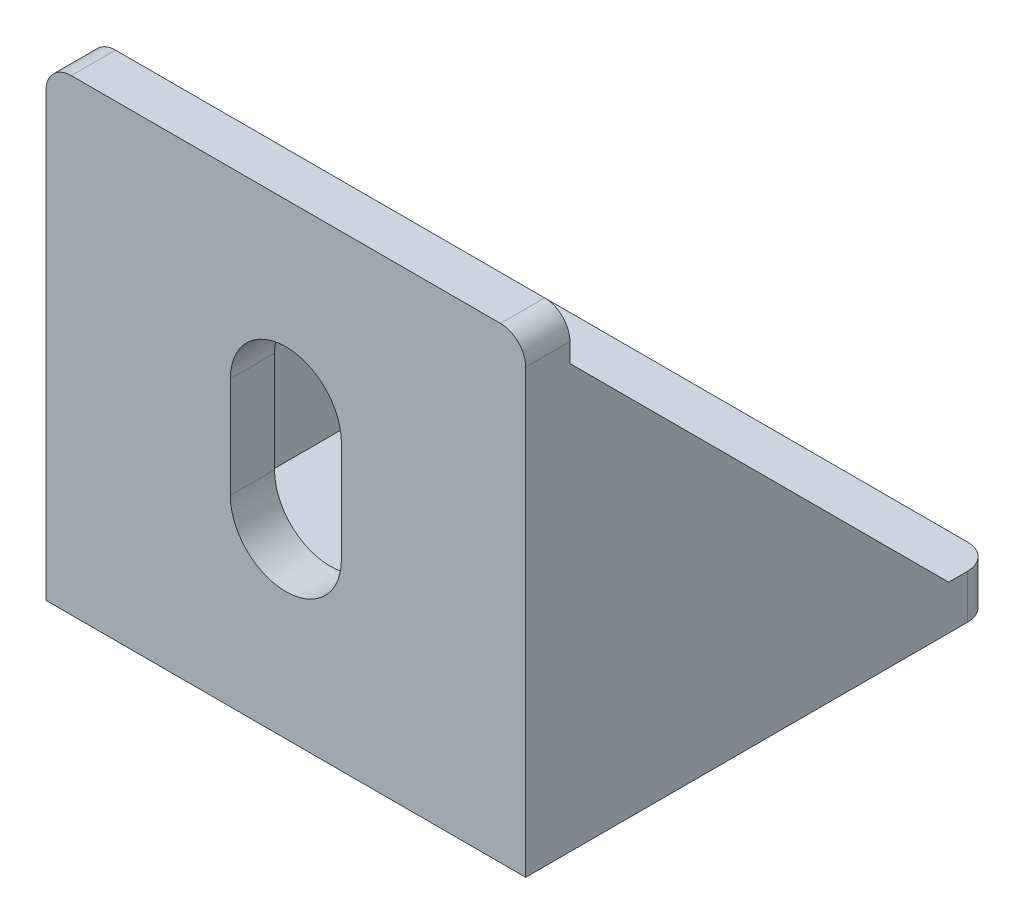
ISO-10303-21;
HEADER;
FILE_DESCRIPTION(('STEP AP214'),'2;1');
FILE_NAME('part.step','',(''),(''),'','','');
FILE_SCHEMA(('AUTOMOTIVE_DESIGN { 1 0 10303 214 1 1 1 1 }'));
ENDSEC;
DATA;
#1=APPLICATION_CONTEXT('core data for automotive mechanical design processes');
#2=APPLICATION_PROTOCOL_DEFINITION('international standard','automotive_design',2000,#1);
#3=PRODUCT_CONTEXT('',#1,'mechanical');
#4=PRODUCT('Part','Part','',(#3));
#5=PRODUCT_RELATED_PRODUCT_CATEGORY('part','',(#4));
#6=PRODUCT_DEFINITION_FORMATION('','',#4);
#7=PRODUCT_DEFINITION_CONTEXT('part definition',#1,'design');
#8=PRODUCT_DEFINITION('design','',#6,#7);
#9=PRODUCT_DEFINITION_SHAPE('','',#8);
#10=(LENGTH_UNIT() NAMED_UNIT(*) SI_UNIT(.MILLI.,.METRE.));
#11=(NAMED_UNIT(*) PLANE_ANGLE_UNIT() SI_UNIT($,.RADIAN.));
#12=(NAMED_UNIT(*) SI_UNIT($,.STERADIAN.) SOLID_ANGLE_UNIT());
#13=UNCERTAINTY_MEASURE_WITH_UNIT(LENGTH_MEASURE(1.E-05),#10,'distance_accuracy_value','');
#14=(GEOMETRIC_REPRESENTATION_CONTEXT(3) GLOBAL_UNCERTAINTY_ASSIGNED_CONTEXT((#13)) GLOBAL_UNIT_ASSIGNED_CONTEXT((#10,
#11,#12)) REPRESENTATION_CONTEXT('',''));
#15=CARTESIAN_POINT('',(0.,0.,0.));
#16=DIRECTION('',(0.,0.,1.));
#17=DIRECTION('',(1.,0.,0.));
#18=AXIS2_PLACEMENT_3D('',#15,#16,#17);
#19=CARTESIAN_POINT('',(38.,33.5,-3.5));
#20=DIRECTION('',(0.,-0.707106781186548,0.707106781186548));
#21=DIRECTION('',(0.,-0.707106781186548,-0.707106781186548));
#22=AXIS2_PLACEMENT_3D('',#19,#20,#21);
#23=PLANE('',#22);
#24=DIRECTION('',(-1.,0.,0.));
#25=VECTOR('',#24,1.);
#26=CARTESIAN_POINT('',(38.,33.5,-3.5));
#27=LINE('',#26,#25);
#28=CARTESIAN_POINT('',(3.5,33.5,-3.5));
#29=VERTEX_POINT('',#28);
#30=CARTESIAN_POINT('',(0.,33.5,-3.5));
#31=VERTEX_POINT('',#30);
#32=EDGE_CURVE('E300',#29,#31,#27,.T.);
#33=ORIENTED_EDGE('',*,*,#32,.F.);
#34=DIRECTION('',(0.,-0.707106781186548,-0.707106781186548));
#35=VECTOR('',#34,1.);
#36=CARTESIAN_POINT('',(3.5,33.5,-3.5));
#37=LINE('',#36,#35);
#38=CARTESIAN_POINT('',(3.5,3.5,-33.5));
#39=VERTEX_POINT('',#38);
#40=EDGE_CURVE('E317',#29,#39,#37,.T.);
#41=ORIENTED_EDGE('',*,*,#40,.T.);
#42=DIRECTION('',(-1.,0.,0.));
#43=VECTOR('',#42,1.);
#44=CARTESIAN_POINT('',(38.,3.5,-33.5));
#45=LINE('',#44,#43);
#46=CARTESIAN_POINT('',(0.,3.5,-33.5));
#47=VERTEX_POINT('',#46);
#48=EDGE_CURVE('E304',#39,#47,#45,.T.);
#49=ORIENTED_EDGE('',*,*,#48,.T.);
#50=DIRECTION('',(0.,0.707106781186547,0.707106781186547));
#51=VECTOR('',#50,1.);
#52=CARTESIAN_POINT('',(0.,33.5,-3.5));
#53=LINE('',#52,#51);
#54=EDGE_CURVE('E285',#47,#31,#53,.T.);
#55=ORIENTED_EDGE('',*,*,#54,.T.);
#56=EDGE_LOOP('',(#33,#41,#49,#55));
#57=FACE_BOUND('',#56,.T.);
#58=ADVANCED_FACE('F39',(#57),#23,.F.);
#59=CARTESIAN_POINT('',(38.,0.,0.));
#60=DIRECTION('',(0.,1.,0.));
#61=DIRECTION('',(0.,0.,1.));
#62=AXIS2_PLACEMENT_3D('',#59,#60,#61);
#63=PLANE('',#62);
#64=DIRECTION('',(0.,0.,-1.));
#65=VECTOR('',#64,1.);
#66=CARTESIAN_POINT('',(23.4,0.,0.));
#67=LINE('',#66,#65);
#68=CARTESIAN_POINT('',(23.4,0.,-14.5));
#69=VERTEX_POINT('',#68);
#70=CARTESIAN_POINT('',(23.4,0.,-22.5));
#71=VERTEX_POINT('',#70);
#72=EDGE_CURVE('E228',#69,#71,#67,.T.);
#73=ORIENTED_EDGE('',*,*,#72,.T.);
#74=CARTESIAN_POINT('',(19.,0.,-22.5));
#75=DIRECTION('',(0.,1.,0.));
#76=DIRECTION('',(0.,0.,1.));
#77=AXIS2_PLACEMENT_3D('',#74,#75,#76);
#78=CIRCLE('',#77,4.4);
#79=CARTESIAN_POINT('',(14.6,0.,-22.5));
#80=VERTEX_POINT('',#79);
#81=EDGE_CURVE('E231',#71,#80,#78,.T.);
#82=ORIENTED_EDGE('',*,*,#81,.T.);
#83=DIRECTION('',(0.,0.,1.));
#84=VECTOR('',#83,1.);
#85=CARTESIAN_POINT('',(14.6,0.,0.));
#86=LINE('',#85,#84);
#87=CARTESIAN_POINT('',(14.6,0.,-14.5));
#88=VERTEX_POINT('',#87);
#89=EDGE_CURVE('E223',#80,#88,#86,.T.);
#90=ORIENTED_EDGE('',*,*,#89,.T.);
#91=CARTESIAN_POINT('',(19.,0.,-14.5));
#92=DIRECTION('',(0.,1.,0.));
#93=DIRECTION('',(0.,0.,1.));
#94=AXIS2_PLACEMENT_3D('',#91,#92,#93);
#95=CIRCLE('',#94,4.4);
#96=EDGE_CURVE('E198',#88,#69,#95,.T.);
#97=ORIENTED_EDGE('',*,*,#96,.T.);
#98=EDGE_LOOP('',(#73,#82,#90,#97));
#99=FACE_BOUND('',#98,.T.);
#100=DIRECTION('',(0.,0.,-1.));
#101=VECTOR('',#100,1.);
#102=CARTESIAN_POINT('',(0.,0.,0.));
#103=LINE('',#102,#101);
#104=CARTESIAN_POINT('',(0.,0.,0.));
#105=VERTEX_POINT('',#104);
#106=CARTESIAN_POINT('',(0.,0.,-35.));
#107=VERTEX_POINT('',#106);
#108=EDGE_CURVE('E267',#105,#107,#103,.T.);
#109=ORIENTED_EDGE('',*,*,#108,.T.);
#110=CARTESIAN_POINT('',(2.,0.,-35.));
#111=DIRECTION('',(0.,1.,0.));
#112=DIRECTION('',(0.,0.,1.));
#113=AXIS2_PLACEMENT_3D('',#110,#111,#112);
#114=CIRCLE('',#113,2.);
#115=CARTESIAN_POINT('',(2.,0.,-37.));
#116=VERTEX_POINT('',#115);
#117=EDGE_CURVE('E347',#107,#116,#114,.F.);
#118=ORIENTED_EDGE('',*,*,#117,.T.);
#119=DIRECTION('',(-1.,0.,0.));
#120=VECTOR('',#119,1.);
#121=CARTESIAN_POINT('',(38.,0.,-37.));
#122=LINE('',#121,#120);
#123=CARTESIAN_POINT('',(36.,0.,-37.));
#124=VERTEX_POINT('',#123);
#125=EDGE_CURVE('E311',#124,#116,#122,.T.);
#126=ORIENTED_EDGE('',*,*,#125,.F.);
#127=CARTESIAN_POINT('',(36.,0.,-35.));
#128=DIRECTION('',(0.,1.,0.));
#129=DIRECTION('',(0.,0.,1.));
#130=AXIS2_PLACEMENT_3D('',#127,#128,#129);
#131=CIRCLE('',#130,2.);
#132=CARTESIAN_POINT('',(38.,0.,-35.));
#133=VERTEX_POINT('',#132);
#134=EDGE_CURVE('E345',#124,#133,#131,.F.);
#135=ORIENTED_EDGE('',*,*,#134,.T.);
#136=DIRECTION('',(0.,0.,-1.));
#137=VECTOR('',#136,1.);
#138=CARTESIAN_POINT('',(38.,0.,0.));
#139=LINE('',#138,#137);
#140=CARTESIAN_POINT('',(38.,0.,0.));
#141=VERTEX_POINT('',#140);
#142=EDGE_CURVE('E268',#141,#133,#139,.T.);
#143=ORIENTED_EDGE('',*,*,#142,.F.);
#144=DIRECTION('',(-1.,0.,0.));
#145=VECTOR('',#144,1.);
#146=CARTESIAN_POINT('',(38.,0.,0.));
#147=LINE('',#146,#145);
#148=EDGE_CURVE('E280',#141,#105,#147,.T.);
#149=ORIENTED_EDGE('',*,*,#148,.T.);
#150=EDGE_LOOP('',(#109,#118,#126,#135,#143,#149));
#151=FACE_BOUND('',#150,.T.);
#152=ADVANCED_FACE('F392',(#99,#151),#63,.F.);
#153=CARTESIAN_POINT('',(38.,3.5,-37.));
#154=DIRECTION('',(0.,0.,1.));
#155=DIRECTION('',(1.,0.,0.));
#156=AXIS2_PLACEMENT_3D('',#153,#154,#155);
#157=PLANE('',#156);
#158=ORIENTED_EDGE('',*,*,#125,.T.);
#159=DIRECTION('',(0.,1.,0.));
#160=VECTOR('',#159,1.);
#161=CARTESIAN_POINT('',(2.,3.5,-37.));
#162=LINE('',#161,#160);
#163=CARTESIAN_POINT('',(2.,3.5,-37.));
#164=VERTEX_POINT('',#163);
#165=EDGE_CURVE('E334',#116,#164,#162,.T.);
#166=ORIENTED_EDGE('',*,*,#165,.T.);
#167=DIRECTION('',(-1.,0.,0.));
#168=VECTOR('',#167,1.);
#169=CARTESIAN_POINT('',(38.,3.5,-37.));
#170=LINE('',#169,#168);
#171=CARTESIAN_POINT('',(36.,3.5,-37.));
#172=VERTEX_POINT('',#171);
#173=EDGE_CURVE('E308',#172,#164,#170,.T.);
#174=ORIENTED_EDGE('',*,*,#173,.F.);
#175=DIRECTION('',(0.,1.,0.));
#176=VECTOR('',#175,1.);
#177=CARTESIAN_POINT('',(36.,3.5,-37.));
#178=LINE('',#177,#176);
#179=EDGE_CURVE('E332',#172,#124,#178,.F.);
#180=ORIENTED_EDGE('',*,*,#179,.T.);
#181=EDGE_LOOP('',(#158,#166,#174,#180));
#182=FACE_BOUND('',#181,.T.);
#183=ADVANCED_FACE('F396',(#182),#157,.F.);
#184=CARTESIAN_POINT('',(38.,3.5,-33.5));
#185=DIRECTION('',(0.,-1.,0.));
#186=DIRECTION('',(0.,0.,-1.));
#187=AXIS2_PLACEMENT_3D('',#184,#185,#186);
#188=PLANE('',#187);
#189=DIRECTION('',(0.,0.,1.));
#190=VECTOR('',#189,1.);
#191=CARTESIAN_POINT('',(14.6,3.5,-22.5));
#192=LINE('',#191,#190);
#193=CARTESIAN_POINT('',(14.6,3.5,-22.5));
#194=VERTEX_POINT('',#193);
#195=CARTESIAN_POINT('',(14.6,3.5,-14.5));
#196=VERTEX_POINT('',#195);
#197=EDGE_CURVE('E206',#194,#196,#192,.T.);
#198=ORIENTED_EDGE('',*,*,#197,.F.);
#199=CARTESIAN_POINT('',(19.,3.5,-22.5));
#200=DIRECTION('',(0.,1.,0.));
#201=DIRECTION('',(0.,0.,1.));
#202=AXIS2_PLACEMENT_3D('',#199,#200,#201);
#203=CIRCLE('',#202,4.4);
#204=CARTESIAN_POINT('',(23.4,3.5,-22.5));
#205=VERTEX_POINT('',#204);
#206=EDGE_CURVE('E211',#205,#194,#203,.T.);
#207=ORIENTED_EDGE('',*,*,#206,.F.);
#208=DIRECTION('',(0.,0.,-1.));
#209=VECTOR('',#208,1.);
#210=CARTESIAN_POINT('',(23.4,3.5,-22.5));
#211=LINE('',#210,#209);
#212=CARTESIAN_POINT('',(23.4,3.5,-14.5));
#213=VERTEX_POINT('',#212);
#214=EDGE_CURVE('E216',#213,#205,#211,.T.);
#215=ORIENTED_EDGE('',*,*,#214,.F.);
#216=CARTESIAN_POINT('',(19.,3.5,-14.5));
#217=DIRECTION('',(0.,1.,0.));
#218=DIRECTION('',(0.,0.,1.));
#219=AXIS2_PLACEMENT_3D('',#216,#217,#218);
#220=CIRCLE('',#219,4.4);
#221=EDGE_CURVE('E195',#196,#213,#220,.T.);
#222=ORIENTED_EDGE('',*,*,#221,.F.);
#223=EDGE_LOOP('',(#198,#207,#215,#222));
#224=FACE_BOUND('',#223,.T.);
#225=ORIENTED_EDGE('',*,*,#173,.T.);
#226=CARTESIAN_POINT('',(2.,3.5,-35.));
#227=DIRECTION('',(0.,-1.,0.));
#228=DIRECTION('',(0.,0.,-1.));
#229=AXIS2_PLACEMENT_3D('',#226,#227,#228);
#230=CIRCLE('',#229,2.);
#231=CARTESIAN_POINT('',(0.,3.5,-35.));
#232=VERTEX_POINT('',#231);
#233=EDGE_CURVE('E339',#164,#232,#230,.F.);
#234=ORIENTED_EDGE('',*,*,#233,.T.);
#235=DIRECTION('',(0.,0.,1.));
#236=VECTOR('',#235,1.);
#237=CARTESIAN_POINT('',(0.,3.5,-33.5));
#238=LINE('',#237,#236);
#239=EDGE_CURVE('E283',#232,#47,#238,.T.);
#240=ORIENTED_EDGE('',*,*,#239,.T.);
#241=ORIENTED_EDGE('',*,*,#48,.F.);
#242=DIRECTION('',(0.,0.,-1.));
#243=VECTOR('',#242,1.);
#244=CARTESIAN_POINT('',(3.5,3.5,39.639309220246));
#245=LINE('',#244,#243);
#246=CARTESIAN_POINT('',(3.5,3.5,-3.5));
#247=VERTEX_POINT('',#246);
#248=EDGE_CURVE('E260',#247,#39,#245,.T.);
#249=ORIENTED_EDGE('',*,*,#248,.F.);
#250=DIRECTION('',(-1.,0.,0.));
#251=VECTOR('',#250,1.);
#252=CARTESIAN_POINT('',(3.5,3.5,-3.5));
#253=LINE('',#252,#251);
#254=CARTESIAN_POINT('',(34.5,3.5,-3.5));
#255=VERTEX_POINT('',#254);
#256=EDGE_CURVE('E257',#255,#247,#253,.T.);
#257=ORIENTED_EDGE('',*,*,#256,.F.);
#258=DIRECTION('',(0.,0.,-1.));
#259=VECTOR('',#258,1.);
#260=CARTESIAN_POINT('',(34.5,3.5,39.639309220246));
#261=LINE('',#260,#259);
#262=CARTESIAN_POINT('',(34.5,3.5,-33.5));
#263=VERTEX_POINT('',#262);
#264=EDGE_CURVE('E261',#255,#263,#261,.T.);
#265=ORIENTED_EDGE('',*,*,#264,.T.);
#266=CARTESIAN_POINT('',(38.,3.5,-33.5));
#267=VERTEX_POINT('',#266);
#268=EDGE_CURVE('E305',#267,#263,#45,.T.);
#269=ORIENTED_EDGE('',*,*,#268,.F.);
#270=DIRECTION('',(0.,0.,1.));
#271=VECTOR('',#270,1.);
#272=CARTESIAN_POINT('',(38.,3.5,-33.5));
#273=LINE('',#272,#271);
#274=CARTESIAN_POINT('',(38.,3.5,-35.));
#275=VERTEX_POINT('',#274);
#276=EDGE_CURVE('E271',#275,#267,#273,.T.);
#277=ORIENTED_EDGE('',*,*,#276,.F.);
#278=CARTESIAN_POINT('',(36.,3.5,-35.));
#279=DIRECTION('',(0.,-1.,0.));
#280=DIRECTION('',(0.,0.,-1.));
#281=AXIS2_PLACEMENT_3D('',#278,#279,#280);
#282=CIRCLE('',#281,2.);
#283=EDGE_CURVE('E337',#275,#172,#282,.F.);
#284=ORIENTED_EDGE('',*,*,#283,.T.);
#285=EDGE_LOOP('',(#225,#234,#240,#241,#249,#257,#265,#269,#277,#284));
#286=FACE_BOUND('',#285,.T.);
#287=ADVANCED_FACE('F213',(#224,#286),#188,.F.);
#288=ORIENTED_EDGE('',*,*,#268,.T.);
#289=DIRECTION('',(0.,0.707106781186548,0.707106781186548));
#290=VECTOR('',#289,1.);
#291=CARTESIAN_POINT('',(34.5,33.5,-3.5));
#292=LINE('',#291,#290);
#293=CARTESIAN_POINT('',(34.5,33.5,-3.5));
#294=VERTEX_POINT('',#293);
#295=EDGE_CURVE('E314',#263,#294,#292,.T.);
#296=ORIENTED_EDGE('',*,*,#295,.T.);
#297=CARTESIAN_POINT('',(38.,33.5,-3.5));
#298=VERTEX_POINT('',#297);
#299=EDGE_CURVE('E301',#298,#294,#27,.T.);
#300=ORIENTED_EDGE('',*,*,#299,.F.);
#301=DIRECTION('',(0.,0.707106781186547,0.707106781186547));
#302=VECTOR('',#301,1.);
#303=CARTESIAN_POINT('',(38.,33.5,-3.5));
#304=LINE('',#303,#302);
#305=EDGE_CURVE('E274',#267,#298,#304,.T.);
#306=ORIENTED_EDGE('',*,*,#305,.F.);
#307=EDGE_LOOP('',(#288,#296,#300,#306));
#308=FACE_BOUND('',#307,.T.);
#309=ADVANCED_FACE('F373',(#308),#23,.F.);
#310=CARTESIAN_POINT('',(38.,33.5,-3.5));
#311=DIRECTION('',(0.,0.,1.));
#312=DIRECTION('',(1.,0.,0.));
#313=AXIS2_PLACEMENT_3D('',#310,#311,#312);
#314=PLANE('',#313);
#315=DIRECTION('',(0.,-1.,0.));
#316=VECTOR('',#315,1.);
#317=CARTESIAN_POINT('',(23.4,22.5,-3.5));
#318=LINE('',#317,#316);
#319=CARTESIAN_POINT('',(23.4,22.5,-3.5));
#320=VERTEX_POINT('',#319);
#321=CARTESIAN_POINT('',(23.4,14.5,-3.5));
#322=VERTEX_POINT('',#321);
#323=EDGE_CURVE('E236',#320,#322,#318,.T.);
#324=ORIENTED_EDGE('',*,*,#323,.F.);
#325=CARTESIAN_POINT('',(19.,22.5,-3.5));
#326=DIRECTION('',(0.,0.,-1.));
#327=DIRECTION('',(-1.,0.,0.));
#328=AXIS2_PLACEMENT_3D('',#325,#326,#327);
#329=CIRCLE('',#328,4.4);
#330=CARTESIAN_POINT('',(14.6,22.5,-3.5));
#331=VERTEX_POINT('',#330);
#332=EDGE_CURVE('E234',#331,#320,#329,.T.);
#333=ORIENTED_EDGE('',*,*,#332,.F.);
#334=DIRECTION('',(0.,1.,0.));
#335=VECTOR('',#334,1.);
#336=CARTESIAN_POINT('',(14.6,22.5,-3.5));
#337=LINE('',#336,#335);
#338=CARTESIAN_POINT('',(14.6,14.5,-3.5));
#339=VERTEX_POINT('',#338);
#340=EDGE_CURVE('E242',#339,#331,#337,.T.);
#341=ORIENTED_EDGE('',*,*,#340,.F.);
#342=CARTESIAN_POINT('',(19.,14.5,-3.5));
#343=DIRECTION('',(0.,0.,-1.));
#344=DIRECTION('',(-1.,0.,0.));
#345=AXIS2_PLACEMENT_3D('',#342,#343,#344);
#346=CIRCLE('',#345,4.4);
#347=EDGE_CURVE('E239',#322,#339,#346,.T.);
#348=ORIENTED_EDGE('',*,*,#347,.F.);
#349=EDGE_LOOP('',(#324,#333,#341,#348));
#350=FACE_BOUND('',#349,.T.);
#351=DIRECTION('',(0.,1.,0.));
#352=VECTOR('',#351,1.);
#353=CARTESIAN_POINT('',(0.,33.5,-3.5));
#354=LINE('',#353,#352);
#355=CARTESIAN_POINT('',(0.,35.,-3.5));
#356=VERTEX_POINT('',#355);
#357=EDGE_CURVE('E288',#31,#356,#354,.T.);
#358=ORIENTED_EDGE('',*,*,#357,.T.);
#359=CARTESIAN_POINT('',(2.,35.,-3.5));
#360=DIRECTION('',(0.,0.,1.));
#361=DIRECTION('',(1.,0.,0.));
#362=AXIS2_PLACEMENT_3D('',#359,#360,#361);
#363=CIRCLE('',#362,2.);
#364=CARTESIAN_POINT('',(2.,37.,-3.5));
#365=VERTEX_POINT('',#364);
#366=EDGE_CURVE('E358',#356,#365,#363,.F.);
#367=ORIENTED_EDGE('',*,*,#366,.T.);
#368=DIRECTION('',(-1.,0.,0.));
#369=VECTOR('',#368,1.);
#370=CARTESIAN_POINT('',(38.,37.,-3.5));
#371=LINE('',#370,#369);
#372=CARTESIAN_POINT('',(36.,37.,-3.5));
#373=VERTEX_POINT('',#372);
#374=EDGE_CURVE('E297',#373,#365,#371,.T.);
#375=ORIENTED_EDGE('',*,*,#374,.F.);
#376=CARTESIAN_POINT('',(36.,35.,-3.5));
#377=DIRECTION('',(0.,0.,1.));
#378=DIRECTION('',(1.,0.,0.));
#379=AXIS2_PLACEMENT_3D('',#376,#377,#378);
#380=CIRCLE('',#379,2.);
#381=CARTESIAN_POINT('',(38.,35.,-3.5));
#382=VERTEX_POINT('',#381);
#383=EDGE_CURVE('E54',#373,#382,#380,.F.);
#384=ORIENTED_EDGE('',*,*,#383,.T.);
#385=DIRECTION('',(0.,1.,0.));
#386=VECTOR('',#385,1.);
#387=CARTESIAN_POINT('',(38.,33.5,-3.5));
#388=LINE('',#387,#386);
#389=EDGE_CURVE('E276',#298,#382,#388,.T.);
#390=ORIENTED_EDGE('',*,*,#389,.F.);
#391=ORIENTED_EDGE('',*,*,#299,.T.);
#392=DIRECTION('',(0.,-1.,0.));
#393=VECTOR('',#392,1.);
#394=CARTESIAN_POINT('',(34.5,3.5,-3.5));
#395=LINE('',#394,#393);
#396=EDGE_CURVE('E256',#294,#255,#395,.T.);
#397=ORIENTED_EDGE('',*,*,#396,.T.);
#398=ORIENTED_EDGE('',*,*,#256,.T.);
#399=DIRECTION('',(0.,1.,0.));
#400=VECTOR('',#399,1.);
#401=CARTESIAN_POINT('',(3.5,33.5,-3.5));
#402=LINE('',#401,#400);
#403=EDGE_CURVE('E248',#247,#29,#402,.T.);
#404=ORIENTED_EDGE('',*,*,#403,.T.);
#405=ORIENTED_EDGE('',*,*,#32,.T.);
#406=EDGE_LOOP('',(#358,#367,#375,#384,#390,#391,#397,#398,#404,#405));
#407=FACE_BOUND('',#406,.T.);
#408=ADVANCED_FACE('F380',(#350,#407),#314,.F.);
#409=CARTESIAN_POINT('',(38.,37.,0.));
#410=DIRECTION('',(0.,-1.,0.));
#411=DIRECTION('',(0.,0.,-1.));
#412=AXIS2_PLACEMENT_3D('',#409,#410,#411);
#413=PLANE('',#412);
#414=ORIENTED_EDGE('',*,*,#374,.T.);
#415=DIRECTION('',(0.,0.,1.));
#416=VECTOR('',#415,1.);
#417=CARTESIAN_POINT('',(2.,37.,0.));
#418=LINE('',#417,#416);
#419=CARTESIAN_POINT('',(2.,37.,0.));
#420=VERTEX_POINT('',#419);
#421=EDGE_CURVE('E351',#365,#420,#418,.T.);
#422=ORIENTED_EDGE('',*,*,#421,.T.);
#423=DIRECTION('',(-1.,0.,0.));
#424=VECTOR('',#423,1.);
#425=CARTESIAN_POINT('',(38.,37.,0.));
#426=LINE('',#425,#424);
#427=CARTESIAN_POINT('',(36.,37.,0.));
#428=VERTEX_POINT('',#427);
#429=EDGE_CURVE('E294',#428,#420,#426,.T.);
#430=ORIENTED_EDGE('',*,*,#429,.F.);
#431=DIRECTION('',(0.,0.,1.));
#432=VECTOR('',#431,1.);
#433=CARTESIAN_POINT('',(36.,37.,0.));
#434=LINE('',#433,#432);
#435=EDGE_CURVE('E349',#428,#373,#434,.F.);
#436=ORIENTED_EDGE('',*,*,#435,.T.);
#437=EDGE_LOOP('',(#414,#422,#430,#436));
#438=FACE_BOUND('',#437,.T.);
#439=ADVANCED_FACE('F378',(#438),#413,.F.);
#440=CARTESIAN_POINT('',(38.,0.,0.));
#441=DIRECTION('',(0.,0.,-1.));
#442=DIRECTION('',(-1.,0.,0.));
#443=AXIS2_PLACEMENT_3D('',#440,#441,#442);
#444=PLANE('',#443);
#445=DIRECTION('',(0.,1.,0.));
#446=VECTOR('',#445,1.);
#447=CARTESIAN_POINT('',(14.6,0.,0.));
#448=LINE('',#447,#446);
#449=CARTESIAN_POINT('',(14.6,14.5,0.));
#450=VERTEX_POINT('',#449);
#451=CARTESIAN_POINT('',(14.6,22.5,0.));
#452=VERTEX_POINT('',#451);
#453=EDGE_CURVE('E326',#450,#452,#448,.T.);
#454=ORIENTED_EDGE('',*,*,#453,.T.);
#455=CARTESIAN_POINT('',(19.,22.5,0.));
#456=DIRECTION('',(0.,0.,-1.));
#457=DIRECTION('',(-1.,0.,0.));
#458=AXIS2_PLACEMENT_3D('',#455,#456,#457);
#459=CIRCLE('',#458,4.4);
#460=CARTESIAN_POINT('',(23.4,22.5,0.));
#461=VERTEX_POINT('',#460);
#462=EDGE_CURVE('E329',#452,#461,#459,.T.);
#463=ORIENTED_EDGE('',*,*,#462,.T.);
#464=DIRECTION('',(0.,-1.,0.));
#465=VECTOR('',#464,1.);
#466=CARTESIAN_POINT('',(23.4,0.,0.));
#467=LINE('',#466,#465);
#468=CARTESIAN_POINT('',(23.4,14.5,0.));
#469=VERTEX_POINT('',#468);
#470=EDGE_CURVE('E320',#461,#469,#467,.T.);
#471=ORIENTED_EDGE('',*,*,#470,.T.);
#472=CARTESIAN_POINT('',(19.,14.5,0.));
#473=DIRECTION('',(0.,0.,-1.));
#474=DIRECTION('',(-1.,0.,0.));
#475=AXIS2_PLACEMENT_3D('',#472,#473,#474);
#476=CIRCLE('',#475,4.4);
#477=EDGE_CURVE('E323',#469,#450,#476,.T.);
#478=ORIENTED_EDGE('',*,*,#477,.T.);
#479=EDGE_LOOP('',(#454,#463,#471,#478));
#480=FACE_BOUND('',#479,.T.);
#481=ORIENTED_EDGE('',*,*,#429,.T.);
#482=CARTESIAN_POINT('',(2.,35.,0.));
#483=DIRECTION('',(0.,0.,-1.));
#484=DIRECTION('',(-1.,0.,0.));
#485=AXIS2_PLACEMENT_3D('',#482,#483,#484);
#486=CIRCLE('',#485,2.);
#487=CARTESIAN_POINT('',(0.,35.,0.));
#488=VERTEX_POINT('',#487);
#489=EDGE_CURVE('E355',#420,#488,#486,.F.);
#490=ORIENTED_EDGE('',*,*,#489,.T.);
#491=DIRECTION('',(0.,-1.,0.));
#492=VECTOR('',#491,1.);
#493=CARTESIAN_POINT('',(0.,0.,0.));
#494=LINE('',#493,#492);
#495=EDGE_CURVE('E272',#488,#105,#494,.T.);
#496=ORIENTED_EDGE('',*,*,#495,.T.);
#497=ORIENTED_EDGE('',*,*,#148,.F.);
#498=DIRECTION('',(0.,-1.,0.));
#499=VECTOR('',#498,1.);
#500=CARTESIAN_POINT('',(38.,0.,0.));
#501=LINE('',#500,#499);
#502=CARTESIAN_POINT('',(38.,35.,0.));
#503=VERTEX_POINT('',#502);
#504=EDGE_CURVE('E278',#503,#141,#501,.T.);
#505=ORIENTED_EDGE('',*,*,#504,.F.);
#506=CARTESIAN_POINT('',(36.,35.,0.));
#507=DIRECTION('',(0.,0.,-1.));
#508=DIRECTION('',(-1.,0.,0.));
#509=AXIS2_PLACEMENT_3D('',#506,#507,#508);
#510=CIRCLE('',#509,2.);
#511=EDGE_CURVE('E62',#503,#428,#510,.F.);
#512=ORIENTED_EDGE('',*,*,#511,.T.);
#513=EDGE_LOOP('',(#481,#490,#496,#497,#505,#512));
#514=FACE_BOUND('',#513,.T.);
#515=ADVANCED_FACE('F387',(#480,#514),#444,.F.);
#516=CARTESIAN_POINT('',(38.,0.,0.));
#517=DIRECTION('',(-1.,0.,0.));
#518=DIRECTION('',(0.,0.,1.));
#519=AXIS2_PLACEMENT_3D('',#516,#517,#518);
#520=PLANE('',#519);
#521=ORIENTED_EDGE('',*,*,#389,.T.);
#522=DIRECTION('',(0.,0.,1.));
#523=VECTOR('',#522,1.);
#524=CARTESIAN_POINT('',(38.,35.,0.));
#525=LINE('',#524,#523);
#526=EDGE_CURVE('E11',#382,#503,#525,.T.);
#527=ORIENTED_EDGE('',*,*,#526,.T.);
#528=ORIENTED_EDGE('',*,*,#504,.T.);
#529=ORIENTED_EDGE('',*,*,#142,.T.);
#530=DIRECTION('',(0.,1.,0.));
#531=VECTOR('',#530,1.);
#532=CARTESIAN_POINT('',(38.,0.,-35.));
#533=LINE('',#532,#531);
#534=EDGE_CURVE('E47',#133,#275,#533,.T.);
#535=ORIENTED_EDGE('',*,*,#534,.T.);
#536=ORIENTED_EDGE('',*,*,#276,.T.);
#537=ORIENTED_EDGE('',*,*,#305,.T.);
#538=EDGE_LOOP('',(#521,#527,#528,#529,#535,#536,#537));
#539=FACE_BOUND('',#538,.T.);
#540=ADVANCED_FACE('F363',(#539),#520,.F.);
#541=CARTESIAN_POINT('',(0.,0.,0.));
#542=DIRECTION('',(-1.,0.,0.));
#543=DIRECTION('',(0.,0.,1.));
#544=AXIS2_PLACEMENT_3D('',#541,#542,#543);
#545=PLANE('',#544);
#546=ORIENTED_EDGE('',*,*,#239,.F.);
#547=DIRECTION('',(0.,1.,0.));
#548=VECTOR('',#547,1.);
#549=CARTESIAN_POINT('',(0.,0.,-35.));
#550=LINE('',#549,#548);
#551=EDGE_CURVE('E343',#232,#107,#550,.F.);
#552=ORIENTED_EDGE('',*,*,#551,.T.);
#553=ORIENTED_EDGE('',*,*,#108,.F.);
#554=ORIENTED_EDGE('',*,*,#495,.F.);
#555=DIRECTION('',(0.,0.,1.));
#556=VECTOR('',#555,1.);
#557=CARTESIAN_POINT('',(0.,35.,-3.5));
#558=LINE('',#557,#556);
#559=EDGE_CURVE('E341',#488,#356,#558,.F.);
#560=ORIENTED_EDGE('',*,*,#559,.T.);
#561=ORIENTED_EDGE('',*,*,#357,.F.);
#562=ORIENTED_EDGE('',*,*,#54,.F.);
#563=EDGE_LOOP('',(#546,#552,#553,#554,#560,#561,#562));
#564=FACE_BOUND('',#563,.T.);
#565=ADVANCED_FACE('F405',(#564),#545,.T.);
#566=CARTESIAN_POINT('',(3.5,33.5,39.639309220246));
#567=DIRECTION('',(-1.,0.,0.));
#568=DIRECTION('',(0.,-1.,0.));
#569=AXIS2_PLACEMENT_3D('',#566,#567,#568);
#570=PLANE('',#569);
#571=ORIENTED_EDGE('',*,*,#403,.F.);
#572=ORIENTED_EDGE('',*,*,#248,.T.);
#573=ORIENTED_EDGE('',*,*,#40,.F.);
#574=EDGE_LOOP('',(#571,#572,#573));
#575=FACE_BOUND('',#574,.T.);
#576=ADVANCED_FACE('F510',(#575),#570,.F.);
#577=CARTESIAN_POINT('',(34.5,3.5,39.639309220246));
#578=DIRECTION('',(1.,0.,0.));
#579=DIRECTION('',(0.,0.,-1.));
#580=AXIS2_PLACEMENT_3D('',#577,#578,#579);
#581=PLANE('',#580);
#582=ORIENTED_EDGE('',*,*,#264,.F.);
#583=ORIENTED_EDGE('',*,*,#396,.F.);
#584=ORIENTED_EDGE('',*,*,#295,.F.);
#585=EDGE_LOOP('',(#582,#583,#584));
#586=FACE_BOUND('',#585,.T.);
#587=ADVANCED_FACE('F503',(#586),#581,.F.);
#588=CARTESIAN_POINT('',(19.,22.5,34.5));
#589=DIRECTION('',(0.,0.,-1.));
#590=DIRECTION('',(-1.,0.,0.));
#591=AXIS2_PLACEMENT_3D('',#588,#589,#590);
#592=CYLINDRICAL_SURFACE('',#591,4.4);
#593=DIRECTION('',(0.,0.,-1.));
#594=VECTOR('',#593,1.);
#595=CARTESIAN_POINT('',(14.6,22.5,34.5));
#596=LINE('',#595,#594);
#597=EDGE_CURVE('E246',#452,#331,#596,.T.);
#598=ORIENTED_EDGE('',*,*,#597,.T.);
#599=ORIENTED_EDGE('',*,*,#332,.T.);
#600=DIRECTION('',(0.,0.,-1.));
#601=VECTOR('',#600,1.);
#602=CARTESIAN_POINT('',(23.4,22.5,34.5));
#603=LINE('',#602,#601);
#604=EDGE_CURVE('E245',#461,#320,#603,.T.);
#605=ORIENTED_EDGE('',*,*,#604,.F.);
#606=ORIENTED_EDGE('',*,*,#462,.F.);
#607=EDGE_LOOP('',(#598,#599,#605,#606));
#608=FACE_BOUND('',#607,.T.);
#609=ADVANCED_FACE('F495',(#608),#592,.F.);
#610=CARTESIAN_POINT('',(14.6,22.5,34.5));
#611=DIRECTION('',(-1.,0.,0.));
#612=DIRECTION('',(0.,0.,1.));
#613=AXIS2_PLACEMENT_3D('',#610,#611,#612);
#614=PLANE('',#613);
#615=DIRECTION('',(0.,0.,-1.));
#616=VECTOR('',#615,1.);
#617=CARTESIAN_POINT('',(14.6,14.5,34.5));
#618=LINE('',#617,#616);
#619=EDGE_CURVE('E249',#450,#339,#618,.T.);
#620=ORIENTED_EDGE('',*,*,#619,.T.);
#621=ORIENTED_EDGE('',*,*,#340,.T.);
#622=ORIENTED_EDGE('',*,*,#597,.F.);
#623=ORIENTED_EDGE('',*,*,#453,.F.);
#624=EDGE_LOOP('',(#620,#621,#622,#623));
#625=FACE_BOUND('',#624,.T.);
#626=ADVANCED_FACE('F487',(#625),#614,.F.);
#627=CARTESIAN_POINT('',(19.,14.5,34.5));
#628=DIRECTION('',(0.,0.,-1.));
#629=DIRECTION('',(-1.,0.,0.));
#630=AXIS2_PLACEMENT_3D('',#627,#628,#629);
#631=CYLINDRICAL_SURFACE('',#630,4.4);
#632=DIRECTION('',(0.,0.,-1.));
#633=VECTOR('',#632,1.);
#634=CARTESIAN_POINT('',(23.4,14.5,34.5));
#635=LINE('',#634,#633);
#636=EDGE_CURVE('E251',#469,#322,#635,.T.);
#637=ORIENTED_EDGE('',*,*,#636,.T.);
#638=ORIENTED_EDGE('',*,*,#347,.T.);
#639=ORIENTED_EDGE('',*,*,#619,.F.);
#640=ORIENTED_EDGE('',*,*,#477,.F.);
#641=EDGE_LOOP('',(#637,#638,#639,#640));
#642=FACE_BOUND('',#641,.T.);
#643=ADVANCED_FACE('F479',(#642),#631,.F.);
#644=CARTESIAN_POINT('',(23.4,22.5,34.5));
#645=DIRECTION('',(1.,0.,0.));
#646=DIRECTION('',(0.,1.,0.));
#647=AXIS2_PLACEMENT_3D('',#644,#645,#646);
#648=PLANE('',#647);
#649=ORIENTED_EDGE('',*,*,#604,.T.);
#650=ORIENTED_EDGE('',*,*,#323,.T.);
#651=ORIENTED_EDGE('',*,*,#636,.F.);
#652=ORIENTED_EDGE('',*,*,#470,.F.);
#653=EDGE_LOOP('',(#649,#650,#651,#652));
#654=FACE_BOUND('',#653,.T.);
#655=ADVANCED_FACE('F471',(#654),#648,.F.);
#656=CARTESIAN_POINT('',(19.,-34.5,-22.5));
#657=DIRECTION('',(0.,1.,0.));
#658=DIRECTION('',(0.,0.,1.));
#659=AXIS2_PLACEMENT_3D('',#656,#657,#658);
#660=CYLINDRICAL_SURFACE('',#659,4.4);
#661=DIRECTION('',(0.,1.,0.));
#662=VECTOR('',#661,1.);
#663=CARTESIAN_POINT('',(23.4,-34.5,-22.5));
#664=LINE('',#663,#662);
#665=EDGE_CURVE('E221',#71,#205,#664,.T.);
#666=ORIENTED_EDGE('',*,*,#665,.T.);
#667=ORIENTED_EDGE('',*,*,#206,.T.);
#668=DIRECTION('',(0.,1.,0.));
#669=VECTOR('',#668,1.);
#670=CARTESIAN_POINT('',(14.6,-34.5,-22.5));
#671=LINE('',#670,#669);
#672=EDGE_CURVE('E202',#80,#194,#671,.T.);
#673=ORIENTED_EDGE('',*,*,#672,.F.);
#674=ORIENTED_EDGE('',*,*,#81,.F.);
#675=EDGE_LOOP('',(#666,#667,#673,#674));
#676=FACE_BOUND('',#675,.T.);
#677=ADVANCED_FACE('F463',(#676),#660,.F.);
#678=CARTESIAN_POINT('',(23.4,-34.5,-22.5));
#679=DIRECTION('',(1.,0.,0.));
#680=DIRECTION('',(0.,0.,-1.));
#681=AXIS2_PLACEMENT_3D('',#678,#679,#680);
#682=PLANE('',#681);
#683=DIRECTION('',(0.,1.,0.));
#684=VECTOR('',#683,1.);
#685=CARTESIAN_POINT('',(23.4,-34.5,-14.5));
#686=LINE('',#685,#684);
#687=EDGE_CURVE('E201',#69,#213,#686,.T.);
#688=ORIENTED_EDGE('',*,*,#687,.T.);
#689=ORIENTED_EDGE('',*,*,#214,.T.);
#690=ORIENTED_EDGE('',*,*,#665,.F.);
#691=ORIENTED_EDGE('',*,*,#72,.F.);
#692=EDGE_LOOP('',(#688,#689,#690,#691));
#693=FACE_BOUND('',#692,.T.);
#694=ADVANCED_FACE('F456',(#693),#682,.F.);
#695=CARTESIAN_POINT('',(19.,-34.5,-14.5));
#696=DIRECTION('',(0.,1.,0.));
#697=DIRECTION('',(0.,0.,1.));
#698=AXIS2_PLACEMENT_3D('',#695,#696,#697);
#699=CYLINDRICAL_SURFACE('',#698,4.4);
#700=DIRECTION('',(0.,1.,0.));
#701=VECTOR('',#700,1.);
#702=CARTESIAN_POINT('',(14.6,-34.5,-14.5));
#703=LINE('',#702,#701);
#704=EDGE_CURVE('E190',#88,#196,#703,.T.);
#705=ORIENTED_EDGE('',*,*,#704,.T.);
#706=ORIENTED_EDGE('',*,*,#221,.T.);
#707=ORIENTED_EDGE('',*,*,#687,.F.);
#708=ORIENTED_EDGE('',*,*,#96,.F.);
#709=EDGE_LOOP('',(#705,#706,#707,#708));
#710=FACE_BOUND('',#709,.T.);
#711=ADVANCED_FACE('F192',(#710),#699,.F.);
#712=CARTESIAN_POINT('',(14.6,-34.5,-22.5));
#713=DIRECTION('',(-1.,0.,0.));
#714=DIRECTION('',(0.,0.,1.));
#715=AXIS2_PLACEMENT_3D('',#712,#713,#714);
#716=PLANE('',#715);
#717=ORIENTED_EDGE('',*,*,#672,.T.);
#718=ORIENTED_EDGE('',*,*,#197,.T.);
#719=ORIENTED_EDGE('',*,*,#704,.F.);
#720=ORIENTED_EDGE('',*,*,#89,.F.);
#721=EDGE_LOOP('',(#717,#718,#719,#720));
#722=FACE_BOUND('',#721,.T.);
#723=ADVANCED_FACE('F207',(#722),#716,.F.);
#724=CARTESIAN_POINT('',(2.,3.5,-35.));
#725=DIRECTION('',(0.,-1.,0.));
#726=DIRECTION('',(0.,0.,-1.));
#727=AXIS2_PLACEMENT_3D('',#724,#725,#726);
#728=CYLINDRICAL_SURFACE('',#727,2.);
#729=ORIENTED_EDGE('',*,*,#117,.F.);
#730=ORIENTED_EDGE('',*,*,#551,.F.);
#731=ORIENTED_EDGE('',*,*,#233,.F.);
#732=ORIENTED_EDGE('',*,*,#165,.F.);
#733=EDGE_LOOP('',(#729,#730,#731,#732));
#734=FACE_BOUND('',#733,.T.);
#735=ADVANCED_FACE('F407',(#734),#728,.T.);
#736=CARTESIAN_POINT('',(2.,35.,0.));
#737=DIRECTION('',(0.,0.,-1.));
#738=DIRECTION('',(-1.,0.,0.));
#739=AXIS2_PLACEMENT_3D('',#736,#737,#738);
#740=CYLINDRICAL_SURFACE('',#739,2.);
#741=ORIENTED_EDGE('',*,*,#366,.F.);
#742=ORIENTED_EDGE('',*,*,#559,.F.);
#743=ORIENTED_EDGE('',*,*,#489,.F.);
#744=ORIENTED_EDGE('',*,*,#421,.F.);
#745=EDGE_LOOP('',(#741,#742,#743,#744));
#746=FACE_BOUND('',#745,.T.);
#747=ADVANCED_FACE('F385',(#746),#740,.T.);
#748=CARTESIAN_POINT('',(36.,35.,0.));
#749=DIRECTION('',(0.,0.,1.));
#750=DIRECTION('',(1.,0.,0.));
#751=AXIS2_PLACEMENT_3D('',#748,#749,#750);
#752=CYLINDRICAL_SURFACE('',#751,2.);
#753=ORIENTED_EDGE('',*,*,#383,.F.);
#754=ORIENTED_EDGE('',*,*,#435,.F.);
#755=ORIENTED_EDGE('',*,*,#511,.F.);
#756=ORIENTED_EDGE('',*,*,#526,.F.);
#757=EDGE_LOOP('',(#753,#754,#755,#756));
#758=FACE_BOUND('',#757,.T.);
#759=ADVANCED_FACE('F375',(#758),#752,.T.);
#760=CARTESIAN_POINT('',(36.,0.,-35.));
#761=DIRECTION('',(0.,1.,0.));
#762=DIRECTION('',(0.,0.,1.));
#763=AXIS2_PLACEMENT_3D('',#760,#761,#762);
#764=CYLINDRICAL_SURFACE('',#763,2.);
#765=ORIENTED_EDGE('',*,*,#134,.F.);
#766=ORIENTED_EDGE('',*,*,#179,.F.);
#767=ORIENTED_EDGE('',*,*,#283,.F.);
#768=ORIENTED_EDGE('',*,*,#534,.F.);
#769=EDGE_LOOP('',(#765,#766,#767,#768));
#770=FACE_BOUND('',#769,.T.);
#771=ADVANCED_FACE('F41',(#770),#764,.T.);
#772=CLOSED_SHELL('',(#58,#152,#183,#287,#309,#408,#439,#515,#540,#565,#576,#587,#609,#626,#643,
#655,#677,#694,#711,#723,#735,#747,#759,#771));
#773=MANIFOLD_SOLID_BREP('B2',#772);
#774=ADVANCED_BREP_SHAPE_REPRESENTATION('',(#18,#773),#14);
#775=SHAPE_DEFINITION_REPRESENTATION(#9,#774);
ENDSEC;
END-ISO-10303-21;
